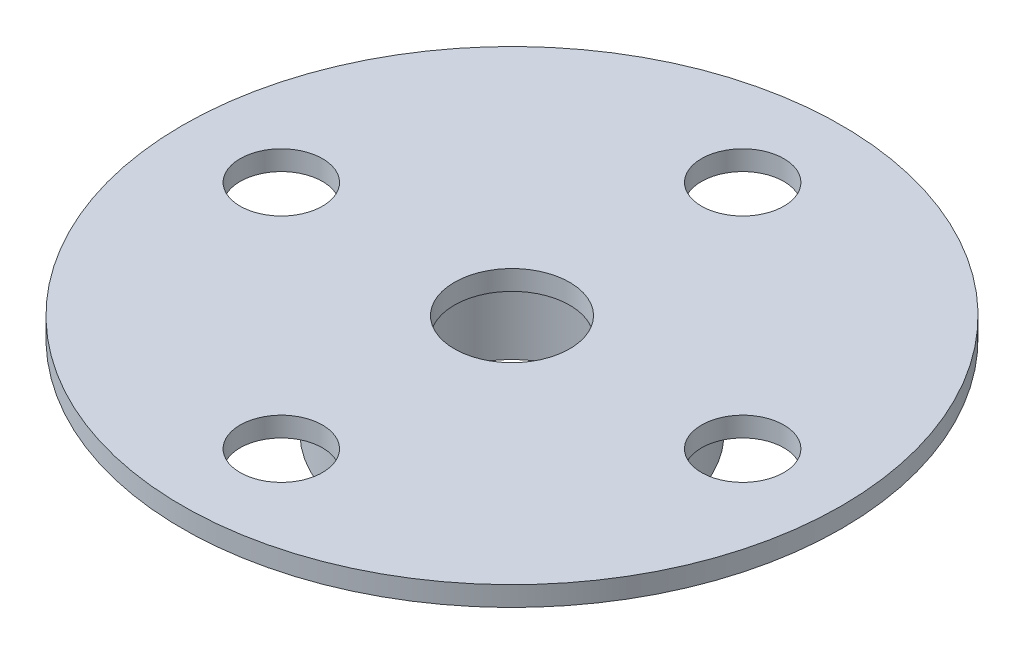
ISO-10303-21;
HEADER;
FILE_DESCRIPTION(('STEP AP214'),'2;1');
FILE_NAME('part.step','',(''),(''),'','','');
FILE_SCHEMA(('AUTOMOTIVE_DESIGN { 1 0 10303 214 1 1 1 1 }'));
ENDSEC;
DATA;
#1=APPLICATION_CONTEXT('core data for automotive mechanical design processes');
#2=APPLICATION_PROTOCOL_DEFINITION('international standard','automotive_design',2000,#1);
#3=PRODUCT_CONTEXT('',#1,'mechanical');
#4=PRODUCT('Part','Part','',(#3));
#5=PRODUCT_RELATED_PRODUCT_CATEGORY('part','',(#4));
#6=PRODUCT_DEFINITION_FORMATION('','',#4);
#7=PRODUCT_DEFINITION_CONTEXT('part definition',#1,'design');
#8=PRODUCT_DEFINITION('design','',#6,#7);
#9=PRODUCT_DEFINITION_SHAPE('','',#8);
#10=(LENGTH_UNIT() NAMED_UNIT(*) SI_UNIT(.MILLI.,.METRE.));
#11=(NAMED_UNIT(*) PLANE_ANGLE_UNIT() SI_UNIT($,.RADIAN.));
#12=(NAMED_UNIT(*) SI_UNIT($,.STERADIAN.) SOLID_ANGLE_UNIT());
#13=UNCERTAINTY_MEASURE_WITH_UNIT(LENGTH_MEASURE(1.E-05),#10,'distance_accuracy_value','');
#14=(GEOMETRIC_REPRESENTATION_CONTEXT(3) GLOBAL_UNCERTAINTY_ASSIGNED_CONTEXT((#13)) GLOBAL_UNIT_ASSIGNED_CONTEXT((#10,
#11,#12)) REPRESENTATION_CONTEXT('',''));
#15=CARTESIAN_POINT('',(0.,0.,0.));
#16=DIRECTION('',(0.,0.,1.));
#17=DIRECTION('',(1.,0.,0.));
#18=AXIS2_PLACEMENT_3D('',#15,#16,#17);
#19=CARTESIAN_POINT('',(0.,0.,0.));
#20=DIRECTION('',(0.,1.,0.));
#21=DIRECTION('',(-1.,0.,0.));
#22=AXIS2_PLACEMENT_3D('',#19,#20,#21);
#23=CYLINDRICAL_SURFACE('',#22,1.75);
#24=CARTESIAN_POINT('',(0.,-0.600000000000001,0.));
#25=DIRECTION('',(0.,1.,0.));
#26=DIRECTION('',(-1.,0.,0.));
#27=AXIS2_PLACEMENT_3D('',#24,#25,#26);
#28=CIRCLE('',#27,1.75);
#29=CARTESIAN_POINT('',(-1.75,-0.600000000000001,0.));
#30=VERTEX_POINT('',#29);
#31=EDGE_CURVE('E70',#30,#30,#28,.T.);
#32=ORIENTED_EDGE('',*,*,#31,.F.);
#33=EDGE_LOOP('',(#32));
#34=FACE_BOUND('',#33,.T.);
#35=CARTESIAN_POINT('',(0.,0.,0.));
#36=DIRECTION('',(0.,1.,0.));
#37=DIRECTION('',(-1.,0.,0.));
#38=AXIS2_PLACEMENT_3D('',#35,#36,#37);
#39=CIRCLE('',#38,1.75);
#40=CARTESIAN_POINT('',(-1.75,0.,0.));
#41=VERTEX_POINT('',#40);
#42=EDGE_CURVE('E10',#41,#41,#39,.T.);
#43=ORIENTED_EDGE('',*,*,#42,.T.);
#44=EDGE_LOOP('',(#43));
#45=FACE_BOUND('',#44,.T.);
#46=ADVANCED_FACE('F37',(#34,#45),#23,.F.);
#47=CARTESIAN_POINT('',(1.75,0.,0.));
#48=DIRECTION('',(0.,-1.,0.));
#49=DIRECTION('',(1.,0.,0.));
#50=AXIS2_PLACEMENT_3D('',#47,#48,#49);
#51=PLANE('',#50);
#52=CARTESIAN_POINT('',(0.,0.,-7.));
#53=DIRECTION('',(0.,1.,0.));
#54=DIRECTION('',(-1.,0.,0.));
#55=AXIS2_PLACEMENT_3D('',#52,#53,#54);
#56=CIRCLE('',#55,1.25);
#57=CARTESIAN_POINT('',(-1.25,0.,-7.));
#58=VERTEX_POINT('',#57);
#59=EDGE_CURVE('E60',#58,#58,#56,.T.);
#60=ORIENTED_EDGE('',*,*,#59,.F.);
#61=EDGE_LOOP('',(#60));
#62=FACE_BOUND('',#61,.T.);
#63=CARTESIAN_POINT('',(7.,0.,0.));
#64=DIRECTION('',(0.,1.,0.));
#65=DIRECTION('',(-1.,0.,0.));
#66=AXIS2_PLACEMENT_3D('',#63,#64,#65);
#67=CIRCLE('',#66,1.25);
#68=CARTESIAN_POINT('',(5.75,0.,0.));
#69=VERTEX_POINT('',#68);
#70=EDGE_CURVE('E155',#69,#69,#67,.T.);
#71=ORIENTED_EDGE('',*,*,#70,.F.);
#72=EDGE_LOOP('',(#71));
#73=FACE_BOUND('',#72,.T.);
#74=CARTESIAN_POINT('',(0.,0.,7.));
#75=DIRECTION('',(0.,1.,0.));
#76=DIRECTION('',(-1.,0.,0.));
#77=AXIS2_PLACEMENT_3D('',#74,#75,#76);
#78=CIRCLE('',#77,1.25);
#79=CARTESIAN_POINT('',(-1.25,0.,7.));
#80=VERTEX_POINT('',#79);
#81=EDGE_CURVE('E159',#80,#80,#78,.T.);
#82=ORIENTED_EDGE('',*,*,#81,.F.);
#83=EDGE_LOOP('',(#82));
#84=FACE_BOUND('',#83,.T.);
#85=CARTESIAN_POINT('',(-7.,0.,0.));
#86=DIRECTION('',(0.,1.,0.));
#87=DIRECTION('',(-1.,0.,0.));
#88=AXIS2_PLACEMENT_3D('',#85,#86,#87);
#89=CIRCLE('',#88,1.25);
#90=CARTESIAN_POINT('',(-8.25,0.,0.));
#91=VERTEX_POINT('',#90);
#92=EDGE_CURVE('E84',#91,#91,#89,.T.);
#93=ORIENTED_EDGE('',*,*,#92,.F.);
#94=EDGE_LOOP('',(#93));
#95=FACE_BOUND('',#94,.T.);
#96=ORIENTED_EDGE('',*,*,#42,.F.);
#97=EDGE_LOOP('',(#96));
#98=FACE_BOUND('',#97,.T.);
#99=CARTESIAN_POINT('',(0.,0.,0.));
#100=DIRECTION('',(0.,1.,0.));
#101=DIRECTION('',(-1.,0.,0.));
#102=AXIS2_PLACEMENT_3D('',#99,#100,#101);
#103=CIRCLE('',#102,10.);
#104=CARTESIAN_POINT('',(-10.,0.,0.));
#105=VERTEX_POINT('',#104);
#106=EDGE_CURVE('E45',#105,#105,#103,.T.);
#107=ORIENTED_EDGE('',*,*,#106,.T.);
#108=EDGE_LOOP('',(#107));
#109=FACE_BOUND('',#108,.T.);
#110=ADVANCED_FACE('F138',(#62,#73,#84,#95,#98,#109),#51,.F.);
#111=CARTESIAN_POINT('',(0.,0.,0.));
#112=DIRECTION('',(0.,1.,0.));
#113=DIRECTION('',(-1.,0.,0.));
#114=AXIS2_PLACEMENT_3D('',#111,#112,#113);
#115=CYLINDRICAL_SURFACE('',#114,10.);
#116=ORIENTED_EDGE('',*,*,#106,.F.);
#117=EDGE_LOOP('',(#116));
#118=FACE_BOUND('',#117,.T.);
#119=CARTESIAN_POINT('',(0.,-0.600000000000001,0.));
#120=DIRECTION('',(0.,1.,0.));
#121=DIRECTION('',(-1.,0.,0.));
#122=AXIS2_PLACEMENT_3D('',#119,#120,#121);
#123=CIRCLE('',#122,10.);
#124=CARTESIAN_POINT('',(-10.,-0.600000000000002,0.));
#125=VERTEX_POINT('',#124);
#126=EDGE_CURVE('E51',#125,#125,#123,.T.);
#127=ORIENTED_EDGE('',*,*,#126,.T.);
#128=EDGE_LOOP('',(#127));
#129=FACE_BOUND('',#128,.T.);
#130=ADVANCED_FACE('F101',(#118,#129),#115,.T.);
#131=CARTESIAN_POINT('',(10.,-0.6,0.));
#132=DIRECTION('',(0.,1.,0.));
#133=DIRECTION('',(-1.,0.,0.));
#134=AXIS2_PLACEMENT_3D('',#131,#132,#133);
#135=PLANE('',#134);
#136=CARTESIAN_POINT('',(0.,-0.600000000000001,-7.));
#137=DIRECTION('',(0.,1.,0.));
#138=DIRECTION('',(-1.,0.,0.));
#139=AXIS2_PLACEMENT_3D('',#136,#137,#138);
#140=CIRCLE('',#139,1.25);
#141=CARTESIAN_POINT('',(-1.25,-0.600000000000001,-7.));
#142=VERTEX_POINT('',#141);
#143=EDGE_CURVE('E40',#142,#142,#140,.T.);
#144=ORIENTED_EDGE('',*,*,#143,.T.);
#145=EDGE_LOOP('',(#144));
#146=FACE_BOUND('',#145,.T.);
#147=CARTESIAN_POINT('',(7.,-0.6,0.));
#148=DIRECTION('',(0.,1.,0.));
#149=DIRECTION('',(-1.,0.,0.));
#150=AXIS2_PLACEMENT_3D('',#147,#148,#149);
#151=CIRCLE('',#150,1.25);
#152=CARTESIAN_POINT('',(5.75,-0.600000000000001,0.));
#153=VERTEX_POINT('',#152);
#154=EDGE_CURVE('E63',#153,#153,#151,.T.);
#155=ORIENTED_EDGE('',*,*,#154,.T.);
#156=EDGE_LOOP('',(#155));
#157=FACE_BOUND('',#156,.T.);
#158=CARTESIAN_POINT('',(0.,-0.600000000000001,7.));
#159=DIRECTION('',(0.,1.,0.));
#160=DIRECTION('',(-1.,0.,0.));
#161=AXIS2_PLACEMENT_3D('',#158,#159,#160);
#162=CIRCLE('',#161,1.25);
#163=CARTESIAN_POINT('',(-1.25,-0.600000000000001,7.));
#164=VERTEX_POINT('',#163);
#165=EDGE_CURVE('E59',#164,#164,#162,.T.);
#166=ORIENTED_EDGE('',*,*,#165,.T.);
#167=EDGE_LOOP('',(#166));
#168=FACE_BOUND('',#167,.T.);
#169=CARTESIAN_POINT('',(-7.,-0.600000000000002,0.));
#170=DIRECTION('',(0.,1.,0.));
#171=DIRECTION('',(-1.,0.,0.));
#172=AXIS2_PLACEMENT_3D('',#169,#170,#171);
#173=CIRCLE('',#172,1.25);
#174=CARTESIAN_POINT('',(-8.25,-0.600000000000002,0.));
#175=VERTEX_POINT('',#174);
#176=EDGE_CURVE('E55',#175,#175,#173,.T.);
#177=ORIENTED_EDGE('',*,*,#176,.T.);
#178=EDGE_LOOP('',(#177));
#179=FACE_BOUND('',#178,.T.);
#180=ORIENTED_EDGE('',*,*,#126,.F.);
#181=EDGE_LOOP('',(#180));
#182=FACE_BOUND('',#181,.T.);
#183=CARTESIAN_POINT('',(0.,-0.600000000000001,0.));
#184=DIRECTION('',(0.,1.,0.));
#185=DIRECTION('',(-1.,0.,0.));
#186=AXIS2_PLACEMENT_3D('',#183,#184,#185);
#187=CIRCLE('',#186,4.55);
#188=CARTESIAN_POINT('',(-4.55,-0.600000000000002,0.));
#189=VERTEX_POINT('',#188);
#190=EDGE_CURVE('E94',#189,#189,#187,.T.);
#191=ORIENTED_EDGE('',*,*,#190,.T.);
#192=EDGE_LOOP('',(#191));
#193=FACE_BOUND('',#192,.T.);
#194=ADVANCED_FACE('F103',(#146,#157,#168,#179,#182,#193),#135,.F.);
#195=CARTESIAN_POINT('',(0.,0.,0.));
#196=DIRECTION('',(0.,1.,0.));
#197=DIRECTION('',(-1.,0.,0.));
#198=AXIS2_PLACEMENT_3D('',#195,#196,#197);
#199=CYLINDRICAL_SURFACE('',#198,4.55);
#200=ORIENTED_EDGE('',*,*,#190,.F.);
#201=EDGE_LOOP('',(#200));
#202=FACE_BOUND('',#201,.T.);
#203=CARTESIAN_POINT('',(0.,-3.1,0.));
#204=DIRECTION('',(0.,1.,0.));
#205=DIRECTION('',(-1.,0.,0.));
#206=AXIS2_PLACEMENT_3D('',#203,#204,#205);
#207=CIRCLE('',#206,4.55);
#208=CARTESIAN_POINT('',(-4.55,-3.1,0.));
#209=VERTEX_POINT('',#208);
#210=EDGE_CURVE('E90',#209,#209,#207,.T.);
#211=ORIENTED_EDGE('',*,*,#210,.T.);
#212=EDGE_LOOP('',(#211));
#213=FACE_BOUND('',#212,.T.);
#214=ADVANCED_FACE('F106',(#202,#213),#199,.T.);
#215=CARTESIAN_POINT('',(4.55,-3.1,0.));
#216=DIRECTION('',(0.,1.,0.));
#217=DIRECTION('',(-1.,0.,0.));
#218=AXIS2_PLACEMENT_3D('',#215,#216,#217);
#219=PLANE('',#218);
#220=ORIENTED_EDGE('',*,*,#210,.F.);
#221=EDGE_LOOP('',(#220));
#222=FACE_BOUND('',#221,.T.);
#223=CARTESIAN_POINT('',(0.,-3.1,0.));
#224=DIRECTION('',(0.,1.,0.));
#225=DIRECTION('',(-1.,0.,0.));
#226=AXIS2_PLACEMENT_3D('',#223,#224,#225);
#227=CIRCLE('',#226,2.75);
#228=CARTESIAN_POINT('',(-2.75,-3.1,0.));
#229=VERTEX_POINT('',#228);
#230=EDGE_CURVE('E81',#229,#229,#227,.T.);
#231=ORIENTED_EDGE('',*,*,#230,.T.);
#232=EDGE_LOOP('',(#231));
#233=FACE_BOUND('',#232,.T.);
#234=ADVANCED_FACE('F112',(#222,#233),#219,.F.);
#235=CARTESIAN_POINT('',(0.,0.,0.));
#236=DIRECTION('',(0.,1.,0.));
#237=DIRECTION('',(-1.,0.,0.));
#238=AXIS2_PLACEMENT_3D('',#235,#236,#237);
#239=CYLINDRICAL_SURFACE('',#238,2.75);
#240=ORIENTED_EDGE('',*,*,#230,.F.);
#241=EDGE_LOOP('',(#240));
#242=FACE_BOUND('',#241,.T.);
#243=CARTESIAN_POINT('',(0.,-0.600000000000001,0.));
#244=DIRECTION('',(0.,1.,0.));
#245=DIRECTION('',(-1.,0.,0.));
#246=AXIS2_PLACEMENT_3D('',#243,#244,#245);
#247=CIRCLE('',#246,2.75);
#248=CARTESIAN_POINT('',(-2.75,-0.600000000000002,0.));
#249=VERTEX_POINT('',#248);
#250=EDGE_CURVE('E75',#249,#249,#247,.T.);
#251=ORIENTED_EDGE('',*,*,#250,.T.);
#252=EDGE_LOOP('',(#251));
#253=FACE_BOUND('',#252,.T.);
#254=ADVANCED_FACE('F118',(#242,#253),#239,.F.);
#255=CARTESIAN_POINT('',(2.75,-0.600000000000001,0.));
#256=DIRECTION('',(0.,1.,0.));
#257=DIRECTION('',(-1.,0.,0.));
#258=AXIS2_PLACEMENT_3D('',#255,#256,#257);
#259=PLANE('',#258);
#260=ORIENTED_EDGE('',*,*,#250,.F.);
#261=EDGE_LOOP('',(#260));
#262=FACE_BOUND('',#261,.T.);
#263=ORIENTED_EDGE('',*,*,#31,.T.);
#264=EDGE_LOOP('',(#263));
#265=FACE_BOUND('',#264,.T.);
#266=ADVANCED_FACE('F124',(#262,#265),#259,.F.);
#267=CARTESIAN_POINT('',(-7.,-3.1,0.));
#268=DIRECTION('',(0.,1.,0.));
#269=DIRECTION('',(-1.,0.,0.));
#270=AXIS2_PLACEMENT_3D('',#267,#268,#269);
#271=CYLINDRICAL_SURFACE('',#270,1.25);
#272=ORIENTED_EDGE('',*,*,#92,.T.);
#273=EDGE_LOOP('',(#272));
#274=FACE_BOUND('',#273,.T.);
#275=ORIENTED_EDGE('',*,*,#176,.F.);
#276=EDGE_LOOP('',(#275));
#277=FACE_BOUND('',#276,.T.);
#278=ADVANCED_FACE('F129',(#274,#277),#271,.F.);
#279=CARTESIAN_POINT('',(0.,-3.1,7.));
#280=DIRECTION('',(0.,1.,0.));
#281=DIRECTION('',(-1.,0.,0.));
#282=AXIS2_PLACEMENT_3D('',#279,#280,#281);
#283=CYLINDRICAL_SURFACE('',#282,1.25);
#284=ORIENTED_EDGE('',*,*,#81,.T.);
#285=EDGE_LOOP('',(#284));
#286=FACE_BOUND('',#285,.T.);
#287=ORIENTED_EDGE('',*,*,#165,.F.);
#288=EDGE_LOOP('',(#287));
#289=FACE_BOUND('',#288,.T.);
#290=ADVANCED_FACE('F134',(#286,#289),#283,.F.);
#291=CARTESIAN_POINT('',(7.,-3.1,0.));
#292=DIRECTION('',(0.,1.,0.));
#293=DIRECTION('',(-1.,0.,0.));
#294=AXIS2_PLACEMENT_3D('',#291,#292,#293);
#295=CYLINDRICAL_SURFACE('',#294,1.25);
#296=ORIENTED_EDGE('',*,*,#70,.T.);
#297=EDGE_LOOP('',(#296));
#298=FACE_BOUND('',#297,.T.);
#299=ORIENTED_EDGE('',*,*,#154,.F.);
#300=EDGE_LOOP('',(#299));
#301=FACE_BOUND('',#300,.T.);
#302=ADVANCED_FACE('F176',(#298,#301),#295,.F.);
#303=CARTESIAN_POINT('',(0.,-3.1,-7.));
#304=DIRECTION('',(0.,1.,0.));
#305=DIRECTION('',(-1.,0.,0.));
#306=AXIS2_PLACEMENT_3D('',#303,#304,#305);
#307=CYLINDRICAL_SURFACE('',#306,1.25);
#308=ORIENTED_EDGE('',*,*,#59,.T.);
#309=EDGE_LOOP('',(#308));
#310=FACE_BOUND('',#309,.T.);
#311=ORIENTED_EDGE('',*,*,#143,.F.);
#312=EDGE_LOOP('',(#311));
#313=FACE_BOUND('',#312,.T.);
#314=ADVANCED_FACE('F173',(#310,#313),#307,.F.);
#315=CLOSED_SHELL('',(#46,#110,#130,#194,#214,#234,#254,#266,#278,#290,#302,#314));
#316=MANIFOLD_SOLID_BREP('B2',#315);
#317=ADVANCED_BREP_SHAPE_REPRESENTATION('',(#18,#316),#14);
#318=SHAPE_DEFINITION_REPRESENTATION(#9,#317);
ENDSEC;
END-ISO-10303-21;
